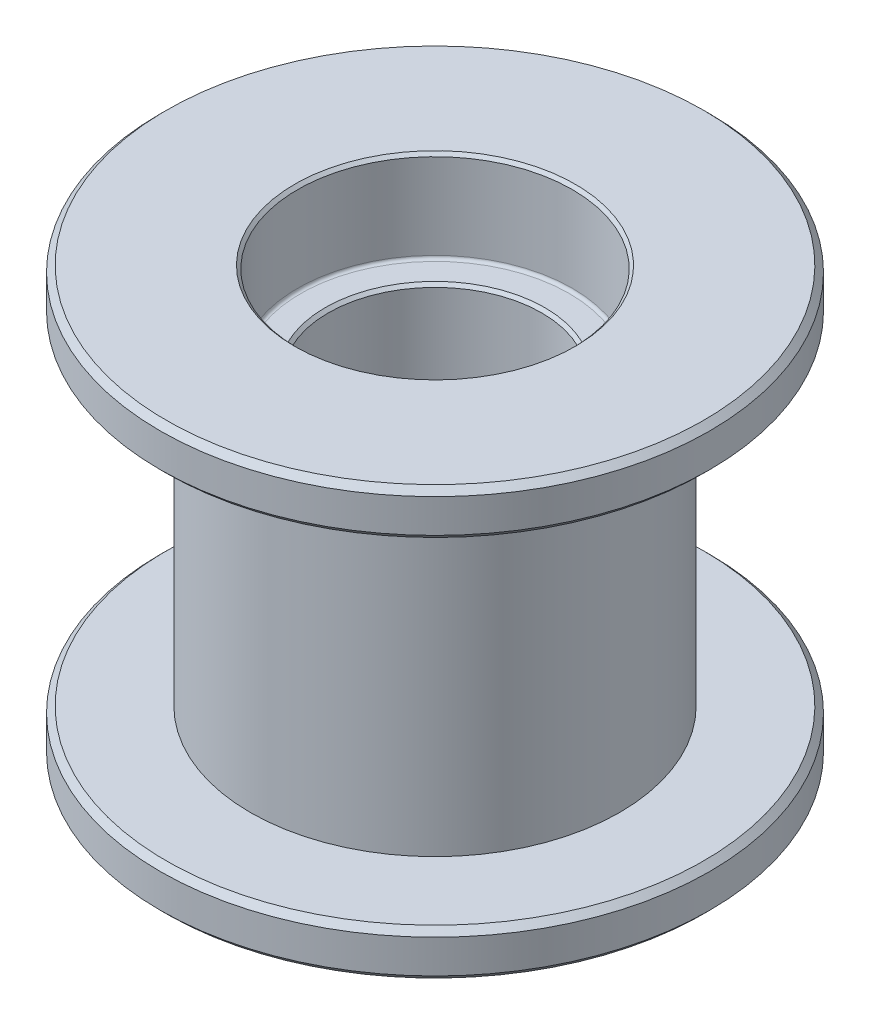
ISO-10303-21;
HEADER;
FILE_DESCRIPTION(('STEP AP214'),'2;1');
FILE_NAME('part.step','',(''),(''),'','','');
FILE_SCHEMA(('AUTOMOTIVE_DESIGN { 1 0 10303 214 1 1 1 1 }'));
ENDSEC;
DATA;
#1=APPLICATION_CONTEXT('core data for automotive mechanical design processes');
#2=APPLICATION_PROTOCOL_DEFINITION('international standard','automotive_design',2000,#1);
#3=PRODUCT_CONTEXT('',#1,'mechanical');
#4=PRODUCT('Part','Part','',(#3));
#5=PRODUCT_RELATED_PRODUCT_CATEGORY('part','',(#4));
#6=PRODUCT_DEFINITION_FORMATION('','',#4);
#7=PRODUCT_DEFINITION_CONTEXT('part definition',#1,'design');
#8=PRODUCT_DEFINITION('design','',#6,#7);
#9=PRODUCT_DEFINITION_SHAPE('','',#8);
#10=(LENGTH_UNIT() NAMED_UNIT(*) SI_UNIT(.MILLI.,.METRE.));
#11=(NAMED_UNIT(*) PLANE_ANGLE_UNIT() SI_UNIT($,.RADIAN.));
#12=(NAMED_UNIT(*) SI_UNIT($,.STERADIAN.) SOLID_ANGLE_UNIT());
#13=UNCERTAINTY_MEASURE_WITH_UNIT(LENGTH_MEASURE(1.E-05),#10,'distance_accuracy_value','');
#14=(GEOMETRIC_REPRESENTATION_CONTEXT(3) GLOBAL_UNCERTAINTY_ASSIGNED_CONTEXT((#13)) GLOBAL_UNIT_ASSIGNED_CONTEXT((#10,
#11,#12)) REPRESENTATION_CONTEXT('',''));
#15=CARTESIAN_POINT('',(0.,0.,0.));
#16=DIRECTION('',(0.,0.,1.));
#17=DIRECTION('',(1.,0.,0.));
#18=AXIS2_PLACEMENT_3D('',#15,#16,#17);
#19=CARTESIAN_POINT('',(0.,-2.5,0.));
#20=DIRECTION('',(0.,-1.,0.));
#21=DIRECTION('',(0.,0.,-1.));
#22=AXIS2_PLACEMENT_3D('',#19,#20,#21);
#23=CYLINDRICAL_SURFACE('',#22,3.5);
#24=CARTESIAN_POINT('',(0.,7.40000000007512,0.));
#25=DIRECTION('',(0.,1.,0.));
#26=DIRECTION('',(0.,0.,-1.));
#27=AXIS2_PLACEMENT_3D('',#24,#25,#26);
#28=CIRCLE('',#27,3.49999999997408);
#29=CARTESIAN_POINT('',(0.,7.40000000007512,-3.49999999997408));
#30=VERTEX_POINT('',#29);
#31=EDGE_CURVE('E60',#30,#30,#28,.T.);
#32=ORIENTED_EDGE('',*,*,#31,.T.);
#33=EDGE_LOOP('',(#32));
#34=FACE_BOUND('',#33,.T.);
#35=CARTESIAN_POINT('',(0.,-0.400000000013279,0.));
#36=DIRECTION('',(0.,-1.,0.));
#37=DIRECTION('',(0.,0.,1.));
#38=AXIS2_PLACEMENT_3D('',#35,#36,#37);
#39=CIRCLE('',#38,3.50000000003093);
#40=CARTESIAN_POINT('',(0.,-0.400000000013279,3.50000000003093));
#41=VERTEX_POINT('',#40);
#42=EDGE_CURVE('E30',#41,#41,#39,.T.);
#43=ORIENTED_EDGE('',*,*,#42,.T.);
#44=EDGE_LOOP('',(#43));
#45=FACE_BOUND('',#44,.T.);
#46=ADVANCED_FACE('F15',(#34,#45),#23,.F.);
#47=CARTESIAN_POINT('',(0.,-0.49999999987449,0.));
#48=DIRECTION('',(0.,-1.,0.));
#49=DIRECTION('',(0.,0.,-1.));
#50=AXIS2_PLACEMENT_3D('',#47,#48,#49);
#51=CONICAL_SURFACE('',#50,3.59999999989213,0.785398163113232);
#52=CARTESIAN_POINT('',(0.,-0.499999999931333,0.));
#53=DIRECTION('',(0.,-1.,0.));
#54=DIRECTION('',(0.,0.,-1.));
#55=AXIS2_PLACEMENT_3D('',#52,#53,#54);
#56=CIRCLE('',#55,3.59999999994898);
#57=CARTESIAN_POINT('',(0.,-0.499999999931333,-3.59999999994898));
#58=VERTEX_POINT('',#57);
#59=EDGE_CURVE('E18',#58,#58,#56,.F.);
#60=ORIENTED_EDGE('',*,*,#59,.F.);
#61=EDGE_LOOP('',(#60));
#62=FACE_BOUND('',#61,.T.);
#63=ORIENTED_EDGE('',*,*,#42,.F.);
#64=EDGE_LOOP('',(#63));
#65=FACE_BOUND('',#64,.T.);
#66=ADVANCED_FACE('F133',(#62,#65),#51,.F.);
#67=CARTESIAN_POINT('',(0.,7.50000000005002,0.));
#68=DIRECTION('',(0.,1.,0.));
#69=DIRECTION('',(-1.,0.,0.));
#70=AXIS2_PLACEMENT_3D('',#67,#68,#69);
#71=CONICAL_SURFACE('',#70,3.60000000000582,0.785398163681665);
#72=CARTESIAN_POINT('',(0.,7.50000000005002,0.));
#73=DIRECTION('',(0.,1.,0.));
#74=DIRECTION('',(-1.,0.,0.));
#75=AXIS2_PLACEMENT_3D('',#72,#73,#74);
#76=CIRCLE('',#75,3.60000000000582);
#77=CARTESIAN_POINT('',(-3.60000000000582,7.50000000005002,0.));
#78=VERTEX_POINT('',#77);
#79=EDGE_CURVE('E52',#78,#78,#76,.F.);
#80=ORIENTED_EDGE('',*,*,#79,.F.);
#81=EDGE_LOOP('',(#80));
#82=FACE_BOUND('',#81,.T.);
#83=ORIENTED_EDGE('',*,*,#31,.F.);
#84=EDGE_LOOP('',(#83));
#85=FACE_BOUND('',#84,.T.);
#86=ADVANCED_FACE('F131',(#82,#85),#71,.F.);
#87=CARTESIAN_POINT('',(3.5,-0.5,0.));
#88=DIRECTION('',(0.,-1.,0.));
#89=DIRECTION('',(0.,0.,-1.));
#90=AXIS2_PLACEMENT_3D('',#87,#88,#89);
#91=PLANE('',#90);
#92=ORIENTED_EDGE('',*,*,#59,.T.);
#93=EDGE_LOOP('',(#92));
#94=FACE_BOUND('',#93,.T.);
#95=CARTESIAN_POINT('',(0.,-0.5,0.));
#96=DIRECTION('',(0.,1.,0.));
#97=DIRECTION('',(0.,0.,1.));
#98=AXIS2_PLACEMENT_3D('',#95,#96,#97);
#99=CIRCLE('',#98,4.4);
#100=CARTESIAN_POINT('',(0.,-0.5,4.4));
#101=VERTEX_POINT('',#100);
#102=EDGE_CURVE('E54',#101,#101,#99,.F.);
#103=ORIENTED_EDGE('',*,*,#102,.T.);
#104=EDGE_LOOP('',(#103));
#105=FACE_BOUND('',#104,.T.);
#106=ADVANCED_FACE('F122',(#94,#105),#91,.T.);
#107=CARTESIAN_POINT('',(4.5,7.5,0.));
#108=DIRECTION('',(0.,1.,0.));
#109=DIRECTION('',(0.,0.,1.));
#110=AXIS2_PLACEMENT_3D('',#107,#108,#109);
#111=PLANE('',#110);
#112=ORIENTED_EDGE('',*,*,#79,.T.);
#113=EDGE_LOOP('',(#112));
#114=FACE_BOUND('',#113,.T.);
#115=CARTESIAN_POINT('',(0.,7.5,0.));
#116=DIRECTION('',(0.,-1.,0.));
#117=DIRECTION('',(0.,0.,-1.));
#118=AXIS2_PLACEMENT_3D('',#115,#116,#117);
#119=CIRCLE('',#118,4.4);
#120=CARTESIAN_POINT('',(0.,7.5,-4.4));
#121=VERTEX_POINT('',#120);
#122=EDGE_CURVE('E58',#121,#121,#119,.F.);
#123=ORIENTED_EDGE('',*,*,#122,.T.);
#124=EDGE_LOOP('',(#123));
#125=FACE_BOUND('',#124,.T.);
#126=ADVANCED_FACE('F86',(#114,#125),#111,.T.);
#127=CARTESIAN_POINT('',(0.,-0.6,0.));
#128=DIRECTION('',(0.,1.,0.));
#129=DIRECTION('',(0.,0.,-1.));
#130=AXIS2_PLACEMENT_3D('',#127,#128,#129);
#131=TOROIDAL_SURFACE('',#130,4.4,0.1);
#132=ORIENTED_EDGE('',*,*,#102,.F.);
#133=EDGE_LOOP('',(#132));
#134=FACE_BOUND('',#133,.T.);
#135=CARTESIAN_POINT('',(0.,-0.6,0.));
#136=DIRECTION('',(0.,-1.,0.));
#137=DIRECTION('',(0.,0.,-1.));
#138=AXIS2_PLACEMENT_3D('',#135,#136,#137);
#139=CIRCLE('',#138,4.5);
#140=CARTESIAN_POINT('',(0.,-0.6,-4.5));
#141=VERTEX_POINT('',#140);
#142=EDGE_CURVE('E212',#141,#141,#139,.T.);
#143=ORIENTED_EDGE('',*,*,#142,.T.);
#144=EDGE_LOOP('',(#143));
#145=FACE_BOUND('',#144,.T.);
#146=ADVANCED_FACE('F74',(#134,#145),#131,.F.);
#147=CARTESIAN_POINT('',(0.,7.6,0.));
#148=DIRECTION('',(0.,-1.,0.));
#149=DIRECTION('',(0.,0.,1.));
#150=AXIS2_PLACEMENT_3D('',#147,#148,#149);
#151=TOROIDAL_SURFACE('',#150,4.4,0.1);
#152=ORIENTED_EDGE('',*,*,#122,.F.);
#153=EDGE_LOOP('',(#152));
#154=FACE_BOUND('',#153,.T.);
#155=CARTESIAN_POINT('',(0.,7.6,0.));
#156=DIRECTION('',(0.,-1.,0.));
#157=DIRECTION('',(0.,0.,-1.));
#158=AXIS2_PLACEMENT_3D('',#155,#156,#157);
#159=CIRCLE('',#158,4.5);
#160=CARTESIAN_POINT('',(0.,7.6,-4.5));
#161=VERTEX_POINT('',#160);
#162=EDGE_CURVE('E217',#161,#161,#159,.F.);
#163=ORIENTED_EDGE('',*,*,#162,.T.);
#164=EDGE_LOOP('',(#163));
#165=FACE_BOUND('',#164,.T.);
#166=ADVANCED_FACE('F85',(#154,#165),#151,.F.);
#167=CARTESIAN_POINT('',(0.,-3.5,0.));
#168=DIRECTION('',(0.,-1.,0.));
#169=DIRECTION('',(0.,0.,-1.));
#170=AXIS2_PLACEMENT_3D('',#167,#168,#169);
#171=CYLINDRICAL_SURFACE('',#170,4.5);
#172=ORIENTED_EDGE('',*,*,#142,.F.);
#173=EDGE_LOOP('',(#172));
#174=FACE_BOUND('',#173,.T.);
#175=CARTESIAN_POINT('',(0.,-3.39999999999918,0.));
#176=DIRECTION('',(0.,-1.,0.));
#177=DIRECTION('',(0.,0.,1.));
#178=AXIS2_PLACEMENT_3D('',#175,#176,#177);
#179=CIRCLE('',#178,4.49999999995043);
#180=CARTESIAN_POINT('',(0.,-3.39999999999918,4.49999999995043));
#181=VERTEX_POINT('',#180);
#182=EDGE_CURVE('E215',#181,#181,#179,.T.);
#183=ORIENTED_EDGE('',*,*,#182,.T.);
#184=EDGE_LOOP('',(#183));
#185=FACE_BOUND('',#184,.T.);
#186=ADVANCED_FACE('F201',(#174,#185),#171,.F.);
#187=CARTESIAN_POINT('',(0.,0.5,0.));
#188=DIRECTION('',(0.,-1.,0.));
#189=DIRECTION('',(0.,0.,-1.));
#190=AXIS2_PLACEMENT_3D('',#187,#188,#189);
#191=CYLINDRICAL_SURFACE('',#190,4.5);
#192=CARTESIAN_POINT('',(0.,10.400000000061,0.));
#193=DIRECTION('',(0.,1.,0.));
#194=DIRECTION('',(0.,0.,-1.));
#195=AXIS2_PLACEMENT_3D('',#192,#193,#194);
#196=CIRCLE('',#195,4.50000000000728);
#197=CARTESIAN_POINT('',(0.,10.400000000061,-4.50000000000728));
#198=VERTEX_POINT('',#197);
#199=EDGE_CURVE('E51',#198,#198,#196,.T.);
#200=ORIENTED_EDGE('',*,*,#199,.T.);
#201=EDGE_LOOP('',(#200));
#202=FACE_BOUND('',#201,.T.);
#203=ORIENTED_EDGE('',*,*,#162,.F.);
#204=EDGE_LOOP('',(#203));
#205=FACE_BOUND('',#204,.T.);
#206=ADVANCED_FACE('F198',(#202,#205),#191,.F.);
#207=CARTESIAN_POINT('',(0.,-3.49999999991724,0.));
#208=DIRECTION('',(0.,-1.,0.));
#209=DIRECTION('',(0.,0.,-1.));
#210=AXIS2_PLACEMENT_3D('',#207,#208,#209);
#211=CONICAL_SURFACE('',#210,4.59999999986849,0.785398163681665);
#212=CARTESIAN_POINT('',(0.,-3.49999999997408,0.));
#213=DIRECTION('',(0.,-1.,0.));
#214=DIRECTION('',(0.,0.,-1.));
#215=AXIS2_PLACEMENT_3D('',#212,#213,#214);
#216=CIRCLE('',#215,4.59999999992533);
#217=CARTESIAN_POINT('',(0.,-3.49999999997408,-4.59999999992533));
#218=VERTEX_POINT('',#217);
#219=EDGE_CURVE('E49',#218,#218,#216,.F.);
#220=ORIENTED_EDGE('',*,*,#219,.F.);
#221=EDGE_LOOP('',(#220));
#222=FACE_BOUND('',#221,.T.);
#223=ORIENTED_EDGE('',*,*,#182,.F.);
#224=EDGE_LOOP('',(#223));
#225=FACE_BOUND('',#224,.T.);
#226=ADVANCED_FACE('F194',(#222,#225),#211,.F.);
#227=CARTESIAN_POINT('',(0.,10.5000000000928,0.));
#228=DIRECTION('',(0.,1.,0.));
#229=DIRECTION('',(0.,0.,1.));
#230=AXIS2_PLACEMENT_3D('',#227,#228,#229);
#231=CONICAL_SURFACE('',#230,4.59999999998217,0.785398163113232);
#232=CARTESIAN_POINT('',(0.,10.5000000000928,0.));
#233=DIRECTION('',(0.,1.,0.));
#234=DIRECTION('',(0.,0.,1.));
#235=AXIS2_PLACEMENT_3D('',#232,#233,#234);
#236=CIRCLE('',#235,4.59999999998217);
#237=CARTESIAN_POINT('',(0.,10.5000000000928,4.59999999998217));
#238=VERTEX_POINT('',#237);
#239=EDGE_CURVE('E46',#238,#238,#236,.F.);
#240=ORIENTED_EDGE('',*,*,#239,.F.);
#241=EDGE_LOOP('',(#240));
#242=FACE_BOUND('',#241,.T.);
#243=ORIENTED_EDGE('',*,*,#199,.F.);
#244=EDGE_LOOP('',(#243));
#245=FACE_BOUND('',#244,.T.);
#246=ADVANCED_FACE('F190',(#242,#245),#231,.F.);
#247=CARTESIAN_POINT('',(5.25,-3.5,0.));
#248=DIRECTION('',(0.,-1.,0.));
#249=DIRECTION('',(0.,0.,-1.));
#250=AXIS2_PLACEMENT_3D('',#247,#248,#249);
#251=PLANE('',#250);
#252=ORIENTED_EDGE('',*,*,#219,.T.);
#253=EDGE_LOOP('',(#252));
#254=FACE_BOUND('',#253,.T.);
#255=CARTESIAN_POINT('',(0.,-3.5,0.));
#256=DIRECTION('',(0.,1.,0.));
#257=DIRECTION('',(-1.,0.,0.));
#258=AXIS2_PLACEMENT_3D('',#255,#256,#257);
#259=CIRCLE('',#258,8.8);
#260=CARTESIAN_POINT('',(-8.8,-3.5,0.));
#261=VERTEX_POINT('',#260);
#262=EDGE_CURVE('E43',#261,#261,#259,.T.);
#263=ORIENTED_EDGE('',*,*,#262,.F.);
#264=EDGE_LOOP('',(#263));
#265=FACE_BOUND('',#264,.T.);
#266=ADVANCED_FACE('F186',(#254,#265),#251,.T.);
#267=CARTESIAN_POINT('',(4.5,10.5,0.));
#268=DIRECTION('',(0.,1.,0.));
#269=DIRECTION('',(0.,0.,1.));
#270=AXIS2_PLACEMENT_3D('',#267,#268,#269);
#271=PLANE('',#270);
#272=ORIENTED_EDGE('',*,*,#239,.T.);
#273=EDGE_LOOP('',(#272));
#274=FACE_BOUND('',#273,.T.);
#275=CARTESIAN_POINT('',(0.,10.5,0.));
#276=DIRECTION('',(0.,-1.,0.));
#277=DIRECTION('',(0.,0.,-1.));
#278=AXIS2_PLACEMENT_3D('',#275,#276,#277);
#279=CIRCLE('',#278,8.8);
#280=CARTESIAN_POINT('',(0.,10.5,-8.8));
#281=VERTEX_POINT('',#280);
#282=EDGE_CURVE('E39',#281,#281,#279,.T.);
#283=ORIENTED_EDGE('',*,*,#282,.F.);
#284=EDGE_LOOP('',(#283));
#285=FACE_BOUND('',#284,.T.);
#286=ADVANCED_FACE('F182',(#274,#285),#271,.T.);
#287=CARTESIAN_POINT('',(0.,-3.3,0.));
#288=DIRECTION('',(0.,1.,0.));
#289=DIRECTION('',(-1.,0.,0.));
#290=AXIS2_PLACEMENT_3D('',#287,#288,#289);
#291=CONICAL_SURFACE('',#290,9.,0.785398163397448);
#292=CARTESIAN_POINT('',(0.,-3.3,0.));
#293=DIRECTION('',(0.,1.,0.));
#294=DIRECTION('',(0.,0.,1.));
#295=AXIS2_PLACEMENT_3D('',#292,#293,#294);
#296=CIRCLE('',#295,9.);
#297=CARTESIAN_POINT('',(0.,-3.3,9.));
#298=VERTEX_POINT('',#297);
#299=EDGE_CURVE('E42',#298,#298,#296,.T.);
#300=ORIENTED_EDGE('',*,*,#299,.F.);
#301=EDGE_LOOP('',(#300));
#302=FACE_BOUND('',#301,.T.);
#303=ORIENTED_EDGE('',*,*,#262,.T.);
#304=EDGE_LOOP('',(#303));
#305=FACE_BOUND('',#304,.T.);
#306=ADVANCED_FACE('F178',(#302,#305),#291,.T.);
#307=CARTESIAN_POINT('',(0.,10.3,0.));
#308=DIRECTION('',(0.,-1.,0.));
#309=DIRECTION('',(0.,0.,-1.));
#310=AXIS2_PLACEMENT_3D('',#307,#308,#309);
#311=CONICAL_SURFACE('',#310,9.,0.785398163397457);
#312=CARTESIAN_POINT('',(0.,10.3,0.));
#313=DIRECTION('',(0.,-1.,0.));
#314=DIRECTION('',(0.,0.,-1.));
#315=AXIS2_PLACEMENT_3D('',#312,#313,#314);
#316=CIRCLE('',#315,9.);
#317=CARTESIAN_POINT('',(0.,10.3,-9.));
#318=VERTEX_POINT('',#317);
#319=EDGE_CURVE('E227',#318,#318,#316,.T.);
#320=ORIENTED_EDGE('',*,*,#319,.F.);
#321=EDGE_LOOP('',(#320));
#322=FACE_BOUND('',#321,.T.);
#323=ORIENTED_EDGE('',*,*,#282,.T.);
#324=EDGE_LOOP('',(#323));
#325=FACE_BOUND('',#324,.T.);
#326=ADVANCED_FACE('F174',(#322,#325),#311,.T.);
#327=CARTESIAN_POINT('',(0.,19.2132034355964,0.));
#328=DIRECTION('',(0.,1.,0.));
#329=DIRECTION('',(0.,0.,1.));
#330=AXIS2_PLACEMENT_3D('',#327,#328,#329);
#331=CYLINDRICAL_SURFACE('',#330,9.);
#332=CARTESIAN_POINT('',(0.,-2.2,0.));
#333=DIRECTION('',(0.,-1.,0.));
#334=DIRECTION('',(0.,0.,1.));
#335=AXIS2_PLACEMENT_3D('',#332,#333,#334);
#336=CIRCLE('',#335,9.);
#337=CARTESIAN_POINT('',(0.,-2.2,9.));
#338=VERTEX_POINT('',#337);
#339=EDGE_CURVE('E224',#338,#338,#336,.F.);
#340=ORIENTED_EDGE('',*,*,#339,.F.);
#341=EDGE_LOOP('',(#340));
#342=FACE_BOUND('',#341,.T.);
#343=ORIENTED_EDGE('',*,*,#299,.T.);
#344=EDGE_LOOP('',(#343));
#345=FACE_BOUND('',#344,.T.);
#346=ADVANCED_FACE('F170',(#342,#345),#331,.T.);
#347=CARTESIAN_POINT('',(0.,-12.2132034355964,0.));
#348=DIRECTION('',(0.,-1.,0.));
#349=DIRECTION('',(0.,0.,-1.));
#350=AXIS2_PLACEMENT_3D('',#347,#348,#349);
#351=CYLINDRICAL_SURFACE('',#350,9.);
#352=CARTESIAN_POINT('',(0.,9.2,0.));
#353=DIRECTION('',(0.,1.,0.));
#354=DIRECTION('',(0.,0.,-1.));
#355=AXIS2_PLACEMENT_3D('',#352,#353,#354);
#356=CIRCLE('',#355,9.);
#357=CARTESIAN_POINT('',(0.,9.2,-9.));
#358=VERTEX_POINT('',#357);
#359=EDGE_CURVE('E38',#358,#358,#356,.F.);
#360=ORIENTED_EDGE('',*,*,#359,.F.);
#361=EDGE_LOOP('',(#360));
#362=FACE_BOUND('',#361,.T.);
#363=ORIENTED_EDGE('',*,*,#319,.T.);
#364=EDGE_LOOP('',(#363));
#365=FACE_BOUND('',#364,.T.);
#366=ADVANCED_FACE('F166',(#362,#365),#351,.T.);
#367=CARTESIAN_POINT('',(0.,-2.2,0.));
#368=DIRECTION('',(0.,-1.,0.));
#369=DIRECTION('',(0.,0.,-1.));
#370=AXIS2_PLACEMENT_3D('',#367,#368,#369);
#371=CONICAL_SURFACE('',#370,9.,0.785398163397444);
#372=ORIENTED_EDGE('',*,*,#339,.T.);
#373=EDGE_LOOP('',(#372));
#374=FACE_BOUND('',#373,.T.);
#375=CARTESIAN_POINT('',(0.,-2.,0.));
#376=DIRECTION('',(0.,-1.,0.));
#377=DIRECTION('',(0.,0.,-1.));
#378=AXIS2_PLACEMENT_3D('',#375,#376,#377);
#379=CIRCLE('',#378,8.8);
#380=CARTESIAN_POINT('',(0.,-2.,-8.8));
#381=VERTEX_POINT('',#380);
#382=EDGE_CURVE('E35',#381,#381,#379,.T.);
#383=ORIENTED_EDGE('',*,*,#382,.T.);
#384=EDGE_LOOP('',(#383));
#385=FACE_BOUND('',#384,.T.);
#386=ADVANCED_FACE('F162',(#374,#385),#371,.T.);
#387=CARTESIAN_POINT('',(0.,9.2,0.));
#388=DIRECTION('',(0.,1.,0.));
#389=DIRECTION('',(0.,0.,1.));
#390=AXIS2_PLACEMENT_3D('',#387,#388,#389);
#391=CONICAL_SURFACE('',#390,9.,0.785398163397448);
#392=ORIENTED_EDGE('',*,*,#359,.T.);
#393=EDGE_LOOP('',(#392));
#394=FACE_BOUND('',#393,.T.);
#395=CARTESIAN_POINT('',(0.,9.,0.));
#396=DIRECTION('',(0.,1.,0.));
#397=DIRECTION('',(0.,0.,1.));
#398=AXIS2_PLACEMENT_3D('',#395,#396,#397);
#399=CIRCLE('',#398,8.8);
#400=CARTESIAN_POINT('',(0.,9.,8.8));
#401=VERTEX_POINT('',#400);
#402=EDGE_CURVE('E27',#401,#401,#399,.T.);
#403=ORIENTED_EDGE('',*,*,#402,.T.);
#404=EDGE_LOOP('',(#403));
#405=FACE_BOUND('',#404,.T.);
#406=ADVANCED_FACE('F158',(#394,#405),#391,.T.);
#407=CARTESIAN_POINT('',(6.11,-2.,0.));
#408=DIRECTION('',(0.,-1.,0.));
#409=DIRECTION('',(0.,0.,-1.));
#410=AXIS2_PLACEMENT_3D('',#407,#408,#409);
#411=PLANE('',#410);
#412=CARTESIAN_POINT('',(0.,-2.,0.));
#413=DIRECTION('',(0.,-1.,0.));
#414=DIRECTION('',(0.,0.,-1.));
#415=AXIS2_PLACEMENT_3D('',#412,#413,#414);
#416=CIRCLE('',#415,6.05);
#417=CARTESIAN_POINT('',(0.,-2.,-6.05));
#418=VERTEX_POINT('',#417);
#419=EDGE_CURVE('E22',#418,#418,#416,.F.);
#420=ORIENTED_EDGE('',*,*,#419,.F.);
#421=EDGE_LOOP('',(#420));
#422=FACE_BOUND('',#421,.T.);
#423=ORIENTED_EDGE('',*,*,#382,.F.);
#424=EDGE_LOOP('',(#423));
#425=FACE_BOUND('',#424,.T.);
#426=ADVANCED_FACE('F151',(#422,#425),#411,.F.);
#427=CARTESIAN_POINT('',(5.25,9.,0.));
#428=DIRECTION('',(0.,1.,0.));
#429=DIRECTION('',(0.,0.,1.));
#430=AXIS2_PLACEMENT_3D('',#427,#428,#429);
#431=PLANE('',#430);
#432=CARTESIAN_POINT('',(0.,9.,0.));
#433=DIRECTION('',(0.,-1.,0.));
#434=DIRECTION('',(0.,0.,-1.));
#435=AXIS2_PLACEMENT_3D('',#432,#433,#434);
#436=CIRCLE('',#435,6.05);
#437=CARTESIAN_POINT('',(0.,9.,-6.05));
#438=VERTEX_POINT('',#437);
#439=EDGE_CURVE('E10',#438,#438,#436,.T.);
#440=ORIENTED_EDGE('',*,*,#439,.F.);
#441=EDGE_LOOP('',(#440));
#442=FACE_BOUND('',#441,.T.);
#443=ORIENTED_EDGE('',*,*,#402,.F.);
#444=EDGE_LOOP('',(#443));
#445=FACE_BOUND('',#444,.T.);
#446=ADVANCED_FACE('F145',(#442,#445),#431,.F.);
#447=CARTESIAN_POINT('',(0.,-2.,0.));
#448=DIRECTION('',(0.,-1.,0.));
#449=DIRECTION('',(0.,0.,-1.));
#450=AXIS2_PLACEMENT_3D('',#447,#448,#449);
#451=CYLINDRICAL_SURFACE('',#450,6.05);
#452=ORIENTED_EDGE('',*,*,#439,.T.);
#453=EDGE_LOOP('',(#452));
#454=FACE_BOUND('',#453,.T.);
#455=ORIENTED_EDGE('',*,*,#419,.T.);
#456=EDGE_LOOP('',(#455));
#457=FACE_BOUND('',#456,.T.);
#458=ADVANCED_FACE('F143',(#454,#457),#451,.T.);
#459=CLOSED_SHELL('',(#46,#66,#86,#106,#126,#146,#166,#186,#206,#226,#246,#266,#286,#306,#326,
#346,#366,#386,#406,#426,#446,#458));
#460=MANIFOLD_SOLID_BREP('B1',#459);
#461=ADVANCED_BREP_SHAPE_REPRESENTATION('',(#18,#460),#14);
#462=SHAPE_DEFINITION_REPRESENTATION(#9,#461);
ENDSEC;
END-ISO-10303-21;
